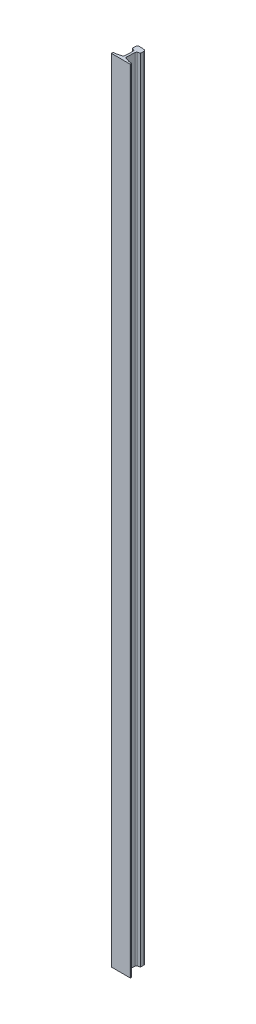
ISO-10303-21;
HEADER;
FILE_DESCRIPTION(('STEP AP214'),'2;1');
FILE_NAME('part.step','',(''),(''),'','','');
FILE_SCHEMA(('AUTOMOTIVE_DESIGN { 1 0 10303 214 1 1 1 1 }'));
ENDSEC;
DATA;
#1=APPLICATION_CONTEXT('core data for automotive mechanical design processes');
#2=APPLICATION_PROTOCOL_DEFINITION('international standard','automotive_design',2000,#1);
#3=PRODUCT_CONTEXT('',#1,'mechanical');
#4=PRODUCT('Part','Part','',(#3));
#5=PRODUCT_RELATED_PRODUCT_CATEGORY('part','',(#4));
#6=PRODUCT_DEFINITION_FORMATION('','',#4);
#7=PRODUCT_DEFINITION_CONTEXT('part definition',#1,'design');
#8=PRODUCT_DEFINITION('design','',#6,#7);
#9=PRODUCT_DEFINITION_SHAPE('','',#8);
#10=(LENGTH_UNIT() NAMED_UNIT(*) SI_UNIT(.MILLI.,.METRE.));
#11=(NAMED_UNIT(*) PLANE_ANGLE_UNIT() SI_UNIT($,.RADIAN.));
#12=(NAMED_UNIT(*) SI_UNIT($,.STERADIAN.) SOLID_ANGLE_UNIT());
#13=UNCERTAINTY_MEASURE_WITH_UNIT(LENGTH_MEASURE(1.E-05),#10,'distance_accuracy_value','');
#14=(GEOMETRIC_REPRESENTATION_CONTEXT(3) GLOBAL_UNCERTAINTY_ASSIGNED_CONTEXT((#13)) GLOBAL_UNIT_ASSIGNED_CONTEXT((#10,
#11,#12)) REPRESENTATION_CONTEXT('',''));
#15=CARTESIAN_POINT('',(0.,0.,0.));
#16=DIRECTION('',(0.,0.,1.));
#17=DIRECTION('',(1.,0.,0.));
#18=AXIS2_PLACEMENT_3D('',#15,#16,#17);
#19=CARTESIAN_POINT('',(40.7594372388262,4620.,-35.0947143526635));
#20=DIRECTION('',(-1.,0.,0.));
#21=DIRECTION('',(0.,0.,1.));
#22=AXIS2_PLACEMENT_3D('',#19,#20,#21);
#23=PLANE('',#22);
#24=DIRECTION('',(0.,0.,-1.));
#25=VECTOR('',#24,1.);
#26=CARTESIAN_POINT('',(40.7594372388262,1540.,-35.0947143526635));
#27=LINE('',#26,#25);
#28=CARTESIAN_POINT('',(40.7594372388262,1540.,-35.5947143526635));
#29=VERTEX_POINT('',#28);
#30=CARTESIAN_POINT('',(40.7594372388262,1540.,-39.1021582767646));
#31=VERTEX_POINT('',#30);
#32=EDGE_CURVE('E275',#29,#31,#27,.T.);
#33=ORIENTED_EDGE('',*,*,#32,.T.);
#34=DIRECTION('',(0.,-1.,0.));
#35=VECTOR('',#34,1.);
#36=CARTESIAN_POINT('',(40.7594372388262,4620.,-39.1021582767646));
#37=LINE('',#36,#35);
#38=CARTESIAN_POINT('',(40.7594372388262,4620.,-39.1021582767646));
#39=VERTEX_POINT('',#38);
#40=EDGE_CURVE('E11',#39,#31,#37,.T.);
#41=ORIENTED_EDGE('',*,*,#40,.F.);
#42=DIRECTION('',(0.,0.,-1.));
#43=VECTOR('',#42,1.);
#44=CARTESIAN_POINT('',(40.7594372388262,4620.,-35.0947143526635));
#45=LINE('',#44,#43);
#46=CARTESIAN_POINT('',(40.7594372388262,4620.,-35.5947143526635));
#47=VERTEX_POINT('',#46);
#48=EDGE_CURVE('E377',#47,#39,#45,.T.);
#49=ORIENTED_EDGE('',*,*,#48,.F.);
#50=DIRECTION('',(0.,-1.,0.));
#51=VECTOR('',#50,1.);
#52=CARTESIAN_POINT('',(40.7594372388262,4620.,-35.5947143526635));
#53=LINE('',#52,#51);
#54=EDGE_CURVE('E70',#47,#29,#53,.T.);
#55=ORIENTED_EDGE('',*,*,#54,.T.);
#56=EDGE_LOOP('',(#33,#41,#49,#55));
#57=FACE_BOUND('',#56,.T.);
#58=ADVANCED_FACE('F53',(#57),#23,.F.);
#59=CARTESIAN_POINT('',(39.2594372388262,4620.,-39.1021582767646));
#60=DIRECTION('',(0.,-1.,0.));
#61=DIRECTION('',(0.,0.,-1.));
#62=AXIS2_PLACEMENT_3D('',#59,#60,#61);
#63=CYLINDRICAL_SURFACE('',#62,1.5);
#64=CARTESIAN_POINT('',(39.2594372388262,1540.,-39.1021582767646));
#65=DIRECTION('',(0.,1.,0.));
#66=DIRECTION('',(0.,0.,1.));
#67=AXIS2_PLACEMENT_3D('',#64,#65,#66);
#68=CIRCLE('',#67,1.5);
#69=CARTESIAN_POINT('',(39.4086899114902,1540.,-40.5947143526635));
#70=VERTEX_POINT('',#69);
#71=EDGE_CURVE('E278',#31,#70,#68,.T.);
#72=ORIENTED_EDGE('',*,*,#71,.T.);
#73=DIRECTION('',(0.,-1.,0.));
#74=VECTOR('',#73,1.);
#75=CARTESIAN_POINT('',(39.4086899114902,4620.,-40.5947143526635));
#76=LINE('',#75,#74);
#77=CARTESIAN_POINT('',(39.4086899114902,4620.,-40.5947143526635));
#78=VERTEX_POINT('',#77);
#79=EDGE_CURVE('E62',#78,#70,#76,.T.);
#80=ORIENTED_EDGE('',*,*,#79,.F.);
#81=CARTESIAN_POINT('',(39.2594372388262,4620.,-39.1021582767646));
#82=DIRECTION('',(0.,1.,0.));
#83=DIRECTION('',(0.,0.,1.));
#84=AXIS2_PLACEMENT_3D('',#81,#82,#83);
#85=CIRCLE('',#84,1.5);
#86=EDGE_CURVE('E168',#39,#78,#85,.T.);
#87=ORIENTED_EDGE('',*,*,#86,.F.);
#88=ORIENTED_EDGE('',*,*,#40,.T.);
#89=EDGE_LOOP('',(#72,#80,#87,#88));
#90=FACE_BOUND('',#89,.T.);
#91=ADVANCED_FACE('F563',(#90),#63,.T.);
#92=CARTESIAN_POINT('',(3.59862844366011,4620.,-44.7599045992653));
#93=DIRECTION('',(-0.115534510185829,0.,0.993303466698934));
#94=DIRECTION('',(0.993303466698934,0.,0.115534510185829));
#95=AXIS2_PLACEMENT_3D('',#92,#93,#94);
#96=PLANE('',#95);
#97=DIRECTION('',(-0.993303466698934,0.,-0.115534510185829));
#98=VECTOR('',#97,1.);
#99=CARTESIAN_POINT('',(3.59862844366011,1540.,-44.7599045992653));
#100=LINE('',#99,#98);
#101=CARTESIAN_POINT('',(28.82415773605,1540.,-41.8258373492434));
#102=VERTEX_POINT('',#101);
#103=EDGE_CURVE('E281',#70,#102,#100,.T.);
#104=ORIENTED_EDGE('',*,*,#103,.T.);
#105=DIRECTION('',(0.,-1.,0.));
#106=VECTOR('',#105,1.);
#107=CARTESIAN_POINT('',(28.82415773605,4620.,-41.8258373492434));
#108=LINE('',#107,#106);
#109=CARTESIAN_POINT('',(28.82415773605,4620.,-41.8258373492434));
#110=VERTEX_POINT('',#109);
#111=EDGE_CURVE('E452',#110,#102,#108,.T.);
#112=ORIENTED_EDGE('',*,*,#111,.F.);
#113=DIRECTION('',(-0.993303466698934,0.,-0.115534510185829));
#114=VECTOR('',#113,1.);
#115=CARTESIAN_POINT('',(3.59862844366011,4620.,-44.7599045992653));
#116=LINE('',#115,#114);
#117=EDGE_CURVE('E461',#78,#110,#116,.T.);
#118=ORIENTED_EDGE('',*,*,#117,.F.);
#119=ORIENTED_EDGE('',*,*,#79,.T.);
#120=EDGE_LOOP('',(#104,#112,#118,#119));
#121=FACE_BOUND('',#120,.T.);
#122=ADVANCED_FACE('F459',(#121),#96,.F.);
#123=CARTESIAN_POINT('',(29.9795028379083,4620.,-51.7588720162328));
#124=DIRECTION('',(0.,-1.,0.));
#125=DIRECTION('',(0.,0.,-1.));
#126=AXIS2_PLACEMENT_3D('',#123,#124,#125);
#127=CYLINDRICAL_SURFACE('',#126,9.99999999999999);
#128=CARTESIAN_POINT('',(29.9795028379083,1540.,-51.7588720162328));
#129=DIRECTION('',(0.,1.,0.));
#130=DIRECTION('',(0.,0.,1.));
#131=AXIS2_PLACEMENT_3D('',#128,#129,#130);
#132=CIRCLE('',#131,9.99999999999999);
#133=CARTESIAN_POINT('',(26.8172251777399,1540.,-42.2720390357276));
#134=VERTEX_POINT('',#133);
#135=EDGE_CURVE('E285',#134,#102,#132,.T.);
#136=ORIENTED_EDGE('',*,*,#135,.F.);
#137=DIRECTION('',(0.,-1.,0.));
#138=VECTOR('',#137,1.);
#139=CARTESIAN_POINT('',(26.8172251777399,4620.,-42.2720390357276));
#140=LINE('',#139,#138);
#141=CARTESIAN_POINT('',(26.8172251777399,4620.,-42.2720390357276));
#142=VERTEX_POINT('',#141);
#143=EDGE_CURVE('E449',#142,#134,#140,.T.);
#144=ORIENTED_EDGE('',*,*,#143,.F.);
#145=CARTESIAN_POINT('',(29.9795028379083,4620.,-51.7588720162328));
#146=DIRECTION('',(0.,1.,0.));
#147=DIRECTION('',(0.,0.,1.));
#148=AXIS2_PLACEMENT_3D('',#145,#146,#147);
#149=CIRCLE('',#148,9.99999999999999);
#150=EDGE_CURVE('E470',#142,#110,#149,.T.);
#151=ORIENTED_EDGE('',*,*,#150,.T.);
#152=ORIENTED_EDGE('',*,*,#111,.T.);
#153=EDGE_LOOP('',(#136,#144,#151,#152));
#154=FACE_BOUND('',#153,.T.);
#155=ADVANCED_FACE('F467',(#154),#127,.F.);
#156=CARTESIAN_POINT('',(7.0619134376368,4620.,-48.8571429490954));
#157=DIRECTION('',(0.316227766016838,0.,-0.948683298050514));
#158=DIRECTION('',(-0.948683298050514,0.,-0.316227766016838));
#159=AXIS2_PLACEMENT_3D('',#156,#157,#158);
#160=PLANE('',#159);
#161=DIRECTION('',(0.948683298050514,0.,0.316227766016838));
#162=VECTOR('',#161,1.);
#163=CARTESIAN_POINT('',(7.0619134376368,1540.,-48.8571429490954));
#164=LINE('',#163,#162);
#165=CARTESIAN_POINT('',(11.8172251777399,1540.,-47.2720390357276));
#166=VERTEX_POINT('',#165);
#167=EDGE_CURVE('E289',#166,#134,#164,.T.);
#168=ORIENTED_EDGE('',*,*,#167,.F.);
#169=DIRECTION('',(0.,-1.,0.));
#170=VECTOR('',#169,1.);
#171=CARTESIAN_POINT('',(11.8172251777399,4620.,-47.2720390357276));
#172=LINE('',#171,#170);
#173=CARTESIAN_POINT('',(11.8172251777399,4620.,-47.2720390357276));
#174=VERTEX_POINT('',#173);
#175=EDGE_CURVE('E446',#174,#166,#172,.T.);
#176=ORIENTED_EDGE('',*,*,#175,.F.);
#177=DIRECTION('',(0.948683298050514,0.,0.316227766016838));
#178=VECTOR('',#177,1.);
#179=CARTESIAN_POINT('',(7.0619134376368,4620.,-48.8571429490954));
#180=LINE('',#179,#178);
#181=EDGE_CURVE('E474',#174,#142,#180,.T.);
#182=ORIENTED_EDGE('',*,*,#181,.T.);
#183=ORIENTED_EDGE('',*,*,#143,.T.);
#184=EDGE_LOOP('',(#168,#176,#182,#183));
#185=FACE_BOUND('',#184,.T.);
#186=ADVANCED_FACE('F578',(#185),#160,.T.);
#187=CARTESIAN_POINT('',(14.6450355001928,4620.,-52.5638713063338));
#188=DIRECTION('',(0.,-1.,0.));
#189=DIRECTION('',(0.,0.,-1.));
#190=AXIS2_PLACEMENT_3D('',#187,#188,#189);
#191=CYLINDRICAL_SURFACE('',#190,6.);
#192=CARTESIAN_POINT('',(14.6450355001928,1540.,-52.5638713063338));
#193=DIRECTION('',(0.,1.,0.));
#194=DIRECTION('',(0.,0.,1.));
#195=AXIS2_PLACEMENT_3D('',#192,#193,#194);
#196=CIRCLE('',#195,6.);
#197=CARTESIAN_POINT('',(8.65544227287482,1540.,-52.9171034838978));
#198=VERTEX_POINT('',#197);
#199=EDGE_CURVE('E293',#198,#166,#196,.T.);
#200=ORIENTED_EDGE('',*,*,#199,.F.);
#201=DIRECTION('',(0.,-1.,0.));
#202=VECTOR('',#201,1.);
#203=CARTESIAN_POINT('',(8.65544227287482,4620.,-52.9171034838978));
#204=LINE('',#203,#202);
#205=CARTESIAN_POINT('',(8.65544227287482,4620.,-52.9171034838978));
#206=VERTEX_POINT('',#205);
#207=EDGE_CURVE('E443',#206,#198,#204,.T.);
#208=ORIENTED_EDGE('',*,*,#207,.F.);
#209=CARTESIAN_POINT('',(14.6450355001928,4620.,-52.5638713063338));
#210=DIRECTION('',(0.,1.,0.));
#211=DIRECTION('',(0.,0.,1.));
#212=AXIS2_PLACEMENT_3D('',#209,#210,#211);
#213=CIRCLE('',#212,6.);
#214=EDGE_CURVE('E478',#206,#174,#213,.T.);
#215=ORIENTED_EDGE('',*,*,#214,.T.);
#216=ORIENTED_EDGE('',*,*,#175,.T.);
#217=EDGE_LOOP('',(#200,#208,#215,#216));
#218=FACE_BOUND('',#217,.T.);
#219=ADVANCED_FACE('F581',(#218),#191,.F.);
#220=CARTESIAN_POINT('',(7.75124412562219,4620.,-34.830906596933));
#221=DIRECTION('',(-0.998752646495627,0.,-0.0499314642082589));
#222=DIRECTION('',(-0.0499314642082589,0.,0.998752646495627));
#223=AXIS2_PLACEMENT_3D('',#220,#221,#222);
#224=PLANE('',#223);
#225=DIRECTION('',(0.0499314642082589,0.,-0.998752646495627));
#226=VECTOR('',#225,1.);
#227=CARTESIAN_POINT('',(7.75124412562219,1540.,-34.830906596933));
#228=LINE('',#227,#226);
#229=CARTESIAN_POINT('',(10.210431510141,1540.,-84.0207300371716));
#230=VERTEX_POINT('',#229);
#231=EDGE_CURVE('E297',#198,#230,#228,.T.);
#232=ORIENTED_EDGE('',*,*,#231,.T.);
#233=DIRECTION('',(0.,-1.,0.));
#234=VECTOR('',#233,1.);
#235=CARTESIAN_POINT('',(10.210431510141,4620.,-84.0207300371716));
#236=LINE('',#235,#234);
#237=CARTESIAN_POINT('',(10.210431510141,4620.,-84.0207300371716));
#238=VERTEX_POINT('',#237);
#239=EDGE_CURVE('E440',#238,#230,#236,.T.);
#240=ORIENTED_EDGE('',*,*,#239,.F.);
#241=DIRECTION('',(0.0499314642082589,0.,-0.998752646495627));
#242=VECTOR('',#241,1.);
#243=CARTESIAN_POINT('',(7.75124412562219,4620.,-34.830906596933));
#244=LINE('',#243,#242);
#245=EDGE_CURVE('E486',#206,#238,#244,.T.);
#246=ORIENTED_EDGE('',*,*,#245,.F.);
#247=ORIENTED_EDGE('',*,*,#207,.T.);
#248=EDGE_LOOP('',(#232,#240,#246,#247));
#249=FACE_BOUND('',#248,.T.);
#250=ADVANCED_FACE('F585',(#249),#224,.F.);
#251=CARTESIAN_POINT('',(16.2043067541645,4620.,-83.7496957974826));
#252=DIRECTION('',(0.,-1.,0.));
#253=DIRECTION('',(0.,0.,-1.));
#254=AXIS2_PLACEMENT_3D('',#251,#252,#253);
#255=CYLINDRICAL_SURFACE('',#254,6.00000000000009);
#256=CARTESIAN_POINT('',(16.2043067541645,1540.,-83.7496957974826));
#257=DIRECTION('',(0.,1.,0.));
#258=DIRECTION('',(0.,0.,1.));
#259=AXIS2_PLACEMENT_3D('',#256,#257,#258);
#260=CIRCLE('',#259,6.00000000000009);
#261=CARTESIAN_POINT('',(14.5927304161733,1540.,-89.5292132260252));
#262=VERTEX_POINT('',#261);
#263=EDGE_CURVE('E301',#262,#230,#260,.T.);
#264=ORIENTED_EDGE('',*,*,#263,.F.);
#265=DIRECTION('',(0.,-1.,0.));
#266=VECTOR('',#265,1.);
#267=CARTESIAN_POINT('',(14.5927304161733,4620.,-89.5292132260252));
#268=LINE('',#267,#266);
#269=CARTESIAN_POINT('',(14.5927304161733,4620.,-89.5292132260252));
#270=VERTEX_POINT('',#269);
#271=EDGE_CURVE('E437',#270,#262,#268,.T.);
#272=ORIENTED_EDGE('',*,*,#271,.F.);
#273=CARTESIAN_POINT('',(16.2043067541645,4620.,-83.7496957974826));
#274=DIRECTION('',(0.,1.,0.));
#275=DIRECTION('',(0.,0.,1.));
#276=AXIS2_PLACEMENT_3D('',#273,#274,#275);
#277=CIRCLE('',#276,6.00000000000009);
#278=EDGE_CURVE('E489',#270,#238,#277,.T.);
#279=ORIENTED_EDGE('',*,*,#278,.T.);
#280=ORIENTED_EDGE('',*,*,#239,.T.);
#281=EDGE_LOOP('',(#264,#272,#279,#280));
#282=FACE_BOUND('',#281,.T.);
#283=ADVANCED_FACE('F589',(#282),#255,.F.);
#284=CARTESIAN_POINT('',(-10.7293993323696,4620.,-82.4720581359521));
#285=DIRECTION('',(-0.268464172063131,0.,-0.963289669994679));
#286=DIRECTION('',(-0.963289669994679,0.,0.268464172063131));
#287=AXIS2_PLACEMENT_3D('',#284,#285,#286);
#288=PLANE('',#287);
#289=DIRECTION('',(0.963289669994679,0.,-0.268464172063131));
#290=VECTOR('',#289,1.);
#291=CARTESIAN_POINT('',(-10.7293993323696,1540.,-82.4720581359521));
#292=LINE('',#291,#290);
#293=CARTESIAN_POINT('',(22.7870136405761,1540.,-91.8129203288972));
#294=VERTEX_POINT('',#293);
#295=EDGE_CURVE('E305',#262,#294,#292,.T.);
#296=ORIENTED_EDGE('',*,*,#295,.T.);
#297=DIRECTION('',(0.,-1.,0.));
#298=VECTOR('',#297,1.);
#299=CARTESIAN_POINT('',(22.7870136405761,4620.,-91.8129203288972));
#300=LINE('',#299,#298);
#301=CARTESIAN_POINT('',(22.7870136405761,4620.,-91.8129203288972));
#302=VERTEX_POINT('',#301);
#303=EDGE_CURVE('E434',#302,#294,#300,.T.);
#304=ORIENTED_EDGE('',*,*,#303,.F.);
#305=DIRECTION('',(0.963289669994679,0.,-0.268464172063131));
#306=VECTOR('',#305,1.);
#307=CARTESIAN_POINT('',(-10.7293993323696,4620.,-82.4720581359521));
#308=LINE('',#307,#306);
#309=EDGE_CURVE('E493',#270,#302,#308,.T.);
#310=ORIENTED_EDGE('',*,*,#309,.F.);
#311=ORIENTED_EDGE('',*,*,#271,.T.);
#312=EDGE_LOOP('',(#296,#304,#310,#311));
#313=FACE_BOUND('',#312,.T.);
#314=ADVANCED_FACE('F593',(#313),#288,.F.);
#315=CARTESIAN_POINT('',(22.518549468513,4620.,-92.7762099988919));
#316=DIRECTION('',(0.,-1.,0.));
#317=DIRECTION('',(0.,0.,-1.));
#318=AXIS2_PLACEMENT_3D('',#315,#316,#317);
#319=CYLINDRICAL_SURFACE('',#318,0.999999999999999);
#320=CARTESIAN_POINT('',(22.518549468513,1540.,-92.7762099988919));
#321=DIRECTION('',(0.,1.,0.));
#322=DIRECTION('',(0.,0.,1.));
#323=AXIS2_PLACEMENT_3D('',#320,#321,#322);
#324=CIRCLE('',#323,0.999999999999999);
#325=CARTESIAN_POINT('',(23.5185494684945,1540.,-92.7762160680998));
#326=VERTEX_POINT('',#325);
#327=EDGE_CURVE('E309',#326,#294,#324,.F.);
#328=ORIENTED_EDGE('',*,*,#327,.F.);
#329=DIRECTION('',(0.,-1.,0.));
#330=VECTOR('',#329,1.);
#331=CARTESIAN_POINT('',(23.5185494684945,4620.,-92.7762160680998));
#332=LINE('',#331,#330);
#333=CARTESIAN_POINT('',(23.5185494684945,4620.,-92.7762160680998));
#334=VERTEX_POINT('',#333);
#335=EDGE_CURVE('E431',#334,#326,#332,.T.);
#336=ORIENTED_EDGE('',*,*,#335,.F.);
#337=CARTESIAN_POINT('',(22.518549468513,4620.,-92.7762099988919));
#338=DIRECTION('',(0.,1.,0.));
#339=DIRECTION('',(0.,0.,1.));
#340=AXIS2_PLACEMENT_3D('',#337,#338,#339);
#341=CIRCLE('',#340,0.999999999999999);
#342=EDGE_CURVE('E496',#334,#302,#341,.F.);
#343=ORIENTED_EDGE('',*,*,#342,.T.);
#344=ORIENTED_EDGE('',*,*,#303,.T.);
#345=EDGE_LOOP('',(#328,#336,#343,#344));
#346=FACE_BOUND('',#345,.T.);
#347=ADVANCED_FACE('F597',(#346),#319,.T.);
#348=CARTESIAN_POINT('',(23.5188995487477,4620.,-35.0948420758813));
#349=DIRECTION('',(0.999999999981582,0.,-6.06920794180174E-06));
#350=DIRECTION('',(-6.06920794180174E-06,0.,-0.999999999981582));
#351=AXIS2_PLACEMENT_3D('',#348,#349,#350);
#352=PLANE('',#351);
#353=DIRECTION('',(6.06920794180174E-06,0.,0.999999999981583));
#354=VECTOR('',#353,1.);
#355=CARTESIAN_POINT('',(23.5188995487477,1540.,-35.0948420758813));
#356=LINE('',#355,#354);
#357=CARTESIAN_POINT('',(23.5184759159674,1540.,-104.89518247869));
#358=VERTEX_POINT('',#357);
#359=EDGE_CURVE('E313',#358,#326,#356,.T.);
#360=ORIENTED_EDGE('',*,*,#359,.F.);
#361=DIRECTION('',(0.,-1.,0.));
#362=VECTOR('',#361,1.);
#363=CARTESIAN_POINT('',(23.5184759159674,4620.,-104.89518247869));
#364=LINE('',#363,#362);
#365=CARTESIAN_POINT('',(23.5184759159674,4620.,-104.89518247869));
#366=VERTEX_POINT('',#365);
#367=EDGE_CURVE('E428',#366,#358,#364,.T.);
#368=ORIENTED_EDGE('',*,*,#367,.F.);
#369=DIRECTION('',(6.06920794180174E-06,0.,0.999999999981583));
#370=VECTOR('',#369,1.);
#371=CARTESIAN_POINT('',(23.5188995487477,4620.,-35.0948420758813));
#372=LINE('',#371,#370);
#373=EDGE_CURVE('E500',#366,#334,#372,.T.);
#374=ORIENTED_EDGE('',*,*,#373,.T.);
#375=ORIENTED_EDGE('',*,*,#335,.T.);
#376=EDGE_LOOP('',(#360,#368,#374,#375));
#377=FACE_BOUND('',#376,.T.);
#378=ADVANCED_FACE('F601',(#377),#352,.T.);
#379=CARTESIAN_POINT('',(17.0195132753637,4620.,-105.011305672061));
#380=DIRECTION('',(0.,-1.,0.));
#381=DIRECTION('',(0.,0.,-1.));
#382=AXIS2_PLACEMENT_3D('',#379,#380,#381);
#383=CYLINDRICAL_SURFACE('',#382,6.50000000000001);
#384=CARTESIAN_POINT('',(17.0195132753637,1540.,-105.011305672061));
#385=DIRECTION('',(0.,1.,0.));
#386=DIRECTION('',(0.,0.,1.));
#387=AXIS2_PLACEMENT_3D('',#384,#385,#386);
#388=CIRCLE('',#387,6.50000000000001);
#389=CARTESIAN_POINT('',(17.8777041256172,1540.,-111.454403410304));
#390=VERTEX_POINT('',#389);
#391=EDGE_CURVE('E317',#390,#358,#388,.F.);
#392=ORIENTED_EDGE('',*,*,#391,.F.);
#393=DIRECTION('',(0.,-1.,0.));
#394=VECTOR('',#393,1.);
#395=CARTESIAN_POINT('',(17.8777041256172,4620.,-111.454403410304));
#396=LINE('',#395,#394);
#397=CARTESIAN_POINT('',(17.8777041256172,4620.,-111.454403410304));
#398=VERTEX_POINT('',#397);
#399=EDGE_CURVE('E425',#398,#390,#396,.T.);
#400=ORIENTED_EDGE('',*,*,#399,.F.);
#401=CARTESIAN_POINT('',(17.0195132753637,4620.,-105.011305672061));
#402=DIRECTION('',(0.,1.,0.));
#403=DIRECTION('',(0.,0.,1.));
#404=AXIS2_PLACEMENT_3D('',#401,#402,#403);
#405=CIRCLE('',#404,6.50000000000001);
#406=EDGE_CURVE('E504',#398,#366,#405,.F.);
#407=ORIENTED_EDGE('',*,*,#406,.T.);
#408=ORIENTED_EDGE('',*,*,#367,.T.);
#409=EDGE_LOOP('',(#392,#400,#407,#408));
#410=FACE_BOUND('',#409,.T.);
#411=ADVANCED_FACE('F605',(#410),#383,.T.);
#412=CARTESIAN_POINT('',(2.63597929414024,4620.,-12.6227798065119));
#413=DIRECTION('',(0.,-1.,0.));
#414=DIRECTION('',(0.,0.,-1.));
#415=AXIS2_PLACEMENT_3D('',#412,#413,#414);
#416=CYLINDRICAL_SURFACE('',#415,100.);
#417=CARTESIAN_POINT('',(2.63597929414024,1540.,-12.6227798065119));
#418=DIRECTION('',(0.,1.,0.));
#419=DIRECTION('',(0.,0.,1.));
#420=AXIS2_PLACEMENT_3D('',#417,#418,#419);
#421=CIRCLE('',#420,100.);
#422=CARTESIAN_POINT('',(-2.67244123679254,1540.,-112.481783764426));
#423=VERTEX_POINT('',#422);
#424=EDGE_CURVE('E321',#390,#423,#421,.T.);
#425=ORIENTED_EDGE('',*,*,#424,.T.);
#426=DIRECTION('',(0.,-1.,0.));
#427=VECTOR('',#426,1.);
#428=CARTESIAN_POINT('',(-2.67244123679254,4620.,-112.481783764426));
#429=LINE('',#428,#427);
#430=CARTESIAN_POINT('',(-2.67244123679254,4620.,-112.481783764426));
#431=VERTEX_POINT('',#430);
#432=EDGE_CURVE('E421',#431,#423,#429,.T.);
#433=ORIENTED_EDGE('',*,*,#432,.F.);
#434=CARTESIAN_POINT('',(2.63597929414024,4620.,-12.6227798065119));
#435=DIRECTION('',(0.,1.,0.));
#436=DIRECTION('',(0.,0.,1.));
#437=AXIS2_PLACEMENT_3D('',#434,#435,#436);
#438=CIRCLE('',#437,100.);
#439=EDGE_CURVE('E508',#398,#431,#438,.T.);
#440=ORIENTED_EDGE('',*,*,#439,.F.);
#441=ORIENTED_EDGE('',*,*,#399,.T.);
#442=EDGE_LOOP('',(#425,#433,#440,#441));
#443=FACE_BOUND('',#442,.T.);
#444=ADVANCED_FACE('F609',(#443),#416,.T.);
#445=CARTESIAN_POINT('',(-2.46285780757964,4620.,-105.985163505692));
#446=DIRECTION('',(0.,-1.,0.));
#447=DIRECTION('',(0.,0.,-1.));
#448=AXIS2_PLACEMENT_3D('',#445,#446,#447);
#449=CYLINDRICAL_SURFACE('',#448,6.49999999999998);
#450=CARTESIAN_POINT('',(-2.46285780757964,1540.,-105.985163505692));
#451=DIRECTION('',(0.,1.,0.));
#452=DIRECTION('',(0.,0.,1.));
#453=AXIS2_PLACEMENT_3D('',#450,#451,#452);
#454=CIRCLE('',#453,6.49999999999998);
#455=CARTESIAN_POINT('',(-8.94098509514056,1540.,-106.517955065459));
#456=VERTEX_POINT('',#455);
#457=EDGE_CURVE('E324',#423,#456,#454,.T.);
#458=ORIENTED_EDGE('',*,*,#457,.T.);
#459=DIRECTION('',(0.,-1.,0.));
#460=VECTOR('',#459,1.);
#461=CARTESIAN_POINT('',(-8.94098509514056,4620.,-106.517955065459));
#462=LINE('',#461,#460);
#463=CARTESIAN_POINT('',(-8.94098509514056,4620.,-106.517955065459));
#464=VERTEX_POINT('',#463);
#465=EDGE_CURVE('E417',#464,#456,#462,.T.);
#466=ORIENTED_EDGE('',*,*,#465,.F.);
#467=CARTESIAN_POINT('',(-2.46285780757964,4620.,-105.985163505692));
#468=DIRECTION('',(0.,1.,0.));
#469=DIRECTION('',(0.,0.,1.));
#470=AXIS2_PLACEMENT_3D('',#467,#468,#469);
#471=CIRCLE('',#470,6.49999999999998);
#472=EDGE_CURVE('E511',#431,#464,#471,.T.);
#473=ORIENTED_EDGE('',*,*,#472,.F.);
#474=ORIENTED_EDGE('',*,*,#432,.T.);
#475=EDGE_LOOP('',(#458,#466,#473,#474));
#476=FACE_BOUND('',#475,.T.);
#477=ADVANCED_FACE('F613',(#476),#449,.T.);
#478=CARTESIAN_POINT('',(-15.9033467847539,4620.,-36.9335277829484));
#479=DIRECTION('',(0.995031640177705,0.,0.0995592037195319));
#480=DIRECTION('',(0.0995592037195319,0.,-0.995031640177705));
#481=AXIS2_PLACEMENT_3D('',#478,#479,#480);
#482=PLANE('',#481);
#483=DIRECTION('',(-0.0995592037195319,0.,0.995031640177705));
#484=VECTOR('',#483,1.);
#485=CARTESIAN_POINT('',(-15.9033467847539,1540.,-36.9335277829484));
#486=LINE('',#485,#484);
#487=CARTESIAN_POINT('',(-10.1503707717966,1540.,-94.4309056667862));
#488=VERTEX_POINT('',#487);
#489=EDGE_CURVE('E327',#456,#488,#486,.T.);
#490=ORIENTED_EDGE('',*,*,#489,.T.);
#491=DIRECTION('',(0.,-1.,0.));
#492=VECTOR('',#491,1.);
#493=CARTESIAN_POINT('',(-10.1503707717966,4620.,-94.4309056667862));
#494=LINE('',#493,#492);
#495=CARTESIAN_POINT('',(-10.1503707717966,4620.,-94.4309056667862));
#496=VERTEX_POINT('',#495);
#497=EDGE_CURVE('E413',#496,#488,#494,.T.);
#498=ORIENTED_EDGE('',*,*,#497,.F.);
#499=DIRECTION('',(-0.0995592037195319,0.,0.995031640177705));
#500=VECTOR('',#499,1.);
#501=CARTESIAN_POINT('',(-15.9033467847539,4620.,-36.9335277829484));
#502=LINE('',#501,#500);
#503=EDGE_CURVE('E514',#464,#496,#502,.T.);
#504=ORIENTED_EDGE('',*,*,#503,.F.);
#505=ORIENTED_EDGE('',*,*,#465,.T.);
#506=EDGE_LOOP('',(#490,#498,#504,#505));
#507=FACE_BOUND('',#506,.T.);
#508=ADVANCED_FACE('F617',(#507),#482,.F.);
#509=CARTESIAN_POINT('',(-9.15533913161888,4620.,-94.3313464630667));
#510=DIRECTION('',(0.,-1.,0.));
#511=DIRECTION('',(0.,0.,-1.));
#512=AXIS2_PLACEMENT_3D('',#509,#510,#511);
#513=CYLINDRICAL_SURFACE('',#512,1.);
#514=CARTESIAN_POINT('',(-9.15533913161888,1540.,-94.3313464630667));
#515=DIRECTION('',(0.,1.,0.));
#516=DIRECTION('',(0.,0.,1.));
#517=AXIS2_PLACEMENT_3D('',#514,#515,#516);
#518=CIRCLE('',#517,1.);
#519=CARTESIAN_POINT('',(-9.51854159596519,1540.,-93.3996362238331));
#520=VERTEX_POINT('',#519);
#521=EDGE_CURVE('E330',#488,#520,#518,.T.);
#522=ORIENTED_EDGE('',*,*,#521,.T.);
#523=DIRECTION('',(0.,-1.,0.));
#524=VECTOR('',#523,1.);
#525=CARTESIAN_POINT('',(-9.51854159596519,4620.,-93.3996362238331));
#526=LINE('',#525,#524);
#527=CARTESIAN_POINT('',(-9.51854159596519,4620.,-93.3996362238331));
#528=VERTEX_POINT('',#527);
#529=EDGE_CURVE('E410',#528,#520,#526,.T.);
#530=ORIENTED_EDGE('',*,*,#529,.F.);
#531=CARTESIAN_POINT('',(-9.15533913161888,4620.,-94.3313464630667));
#532=DIRECTION('',(0.,1.,0.));
#533=DIRECTION('',(0.,0.,1.));
#534=AXIS2_PLACEMENT_3D('',#531,#532,#533);
#535=CIRCLE('',#534,1.);
#536=EDGE_CURVE('E517',#496,#528,#535,.T.);
#537=ORIENTED_EDGE('',*,*,#536,.F.);
#538=ORIENTED_EDGE('',*,*,#497,.T.);
#539=EDGE_LOOP('',(#522,#530,#537,#538));
#540=FACE_BOUND('',#539,.T.);
#541=ADVANCED_FACE('F621',(#540),#513,.T.);
#542=CARTESIAN_POINT('',(20.622724863673,4620.,-81.6498648939999));
#543=DIRECTION('',(-0.363202464346305,0.,0.931710239233621));
#544=DIRECTION('',(0.931710239233621,0.,0.363202464346305));
#545=AXIS2_PLACEMENT_3D('',#542,#543,#544);
#546=PLANE('',#545);
#547=DIRECTION('',(-0.931710239233621,0.,-0.363202464346305));
#548=VECTOR('',#547,1.);
#549=CARTESIAN_POINT('',(20.622724863673,1540.,-81.6498648939999));
#550=LINE('',#549,#548);
#551=CARTESIAN_POINT('',(-1.59289075471972,1540.,-90.310031971489));
#552=VERTEX_POINT('',#551);
#553=EDGE_CURVE('E334',#552,#520,#550,.T.);
#554=ORIENTED_EDGE('',*,*,#553,.F.);
#555=DIRECTION('',(0.,-1.,0.));
#556=VECTOR('',#555,1.);
#557=CARTESIAN_POINT('',(-1.59289075471972,4620.,-90.310031971489));
#558=LINE('',#557,#556);
#559=CARTESIAN_POINT('',(-1.59289075471972,4620.,-90.310031971489));
#560=VERTEX_POINT('',#559);
#561=EDGE_CURVE('E407',#560,#552,#558,.T.);
#562=ORIENTED_EDGE('',*,*,#561,.F.);
#563=DIRECTION('',(-0.931710239233621,0.,-0.363202464346305));
#564=VECTOR('',#563,1.);
#565=CARTESIAN_POINT('',(20.622724863673,4620.,-81.6498648939999));
#566=LINE('',#565,#564);
#567=EDGE_CURVE('E520',#560,#528,#566,.T.);
#568=ORIENTED_EDGE('',*,*,#567,.T.);
#569=ORIENTED_EDGE('',*,*,#529,.T.);
#570=EDGE_LOOP('',(#554,#562,#568,#569));
#571=FACE_BOUND('',#570,.T.);
#572=ADVANCED_FACE('F625',(#571),#546,.T.);
#573=CARTESIAN_POINT('',(-3.77210554079757,4620.,-84.7197705360873));
#574=DIRECTION('',(0.,-1.,0.));
#575=DIRECTION('',(0.,0.,-1.));
#576=AXIS2_PLACEMENT_3D('',#573,#574,#575);
#577=CYLINDRICAL_SURFACE('',#576,6.00000000000001);
#578=CARTESIAN_POINT('',(-3.77210554079757,1540.,-84.7197705360873));
#579=DIRECTION('',(0.,1.,0.));
#580=DIRECTION('',(0.,0.,1.));
#581=AXIS2_PLACEMENT_3D('',#578,#579,#580);
#582=CIRCLE('',#581,6.00000000000001);
#583=CARTESIAN_POINT('',(2.22041033817622,1540.,-84.4201817508377));
#584=VERTEX_POINT('',#583);
#585=EDGE_CURVE('E338',#552,#584,#582,.F.);
#586=ORIENTED_EDGE('',*,*,#585,.T.);
#587=DIRECTION('',(0.,-1.,0.));
#588=VECTOR('',#587,1.);
#589=CARTESIAN_POINT('',(2.22041033817622,4620.,-84.4201817508377));
#590=LINE('',#589,#588);
#591=CARTESIAN_POINT('',(2.22041033817622,4620.,-84.4201817508377));
#592=VERTEX_POINT('',#591);
#593=EDGE_CURVE('E404',#592,#584,#590,.T.);
#594=ORIENTED_EDGE('',*,*,#593,.F.);
#595=CARTESIAN_POINT('',(-3.77210554079757,4620.,-84.7197705360873));
#596=DIRECTION('',(0.,1.,0.));
#597=DIRECTION('',(0.,0.,1.));
#598=AXIS2_PLACEMENT_3D('',#595,#596,#597);
#599=CIRCLE('',#598,6.00000000000001);
#600=EDGE_CURVE('E524',#560,#592,#599,.F.);
#601=ORIENTED_EDGE('',*,*,#600,.F.);
#602=ORIENTED_EDGE('',*,*,#561,.T.);
#603=EDGE_LOOP('',(#586,#594,#601,#602));
#604=FACE_BOUND('',#603,.T.);
#605=ADVANCED_FACE('F629',(#604),#577,.F.);
#606=CARTESIAN_POINT('',(-0.22806660380207,4620.,-35.229231337774));
#607=DIRECTION('',(-0.998763524427815,0.,-0.0497134013373531));
#608=DIRECTION('',(-0.0497134013373531,0.,0.998763524427815));
#609=AXIS2_PLACEMENT_3D('',#606,#607,#608);
#610=PLANE('',#609);
#611=DIRECTION('',(0.0497134013373531,0.,-0.998763524427815));
#612=VECTOR('',#611,1.);
#613=CARTESIAN_POINT('',(-0.22806660380207,1540.,-35.229231337774));
#614=LINE('',#613,#612);
#615=CARTESIAN_POINT('',(0.684732849310307,1540.,-53.5677632901491));
#616=VERTEX_POINT('',#615);
#617=EDGE_CURVE('E342',#616,#584,#614,.T.);
#618=ORIENTED_EDGE('',*,*,#617,.F.);
#619=DIRECTION('',(0.,-1.,0.));
#620=VECTOR('',#619,1.);
#621=CARTESIAN_POINT('',(0.684732849310307,4620.,-53.5677632901491));
#622=LINE('',#621,#620);
#623=CARTESIAN_POINT('',(0.684732849310307,4620.,-53.5677632901491));
#624=VERTEX_POINT('',#623);
#625=EDGE_CURVE('E401',#624,#616,#622,.T.);
#626=ORIENTED_EDGE('',*,*,#625,.F.);
#627=DIRECTION('',(0.0497134013373531,0.,-0.998763524427815));
#628=VECTOR('',#627,1.);
#629=CARTESIAN_POINT('',(-0.22806660380207,4620.,-35.229231337774));
#630=LINE('',#629,#628);
#631=EDGE_CURVE('E527',#624,#592,#630,.T.);
#632=ORIENTED_EDGE('',*,*,#631,.T.);
#633=ORIENTED_EDGE('',*,*,#593,.T.);
#634=EDGE_LOOP('',(#618,#626,#632,#633));
#635=FACE_BOUND('',#634,.T.);
#636=ADVANCED_FACE('F633',(#635),#610,.T.);
#637=CARTESIAN_POINT('',(-5.30778302966346,4620.,-53.8673520753987));
#638=DIRECTION('',(0.,-1.,0.));
#639=DIRECTION('',(0.,0.,-1.));
#640=AXIS2_PLACEMENT_3D('',#637,#638,#639);
#641=CYLINDRICAL_SURFACE('',#640,6.);
#642=CARTESIAN_POINT('',(-5.30778302966346,1540.,-53.8673520753987));
#643=DIRECTION('',(0.,1.,0.));
#644=DIRECTION('',(0.,0.,1.));
#645=AXIS2_PLACEMENT_3D('',#642,#643,#644);
#646=CIRCLE('',#645,6.);
#647=CARTESIAN_POINT('',(-3.53928627099803,1540.,-48.1339046644085));
#648=VERTEX_POINT('',#647);
#649=EDGE_CURVE('E346',#616,#648,#646,.F.);
#650=ORIENTED_EDGE('',*,*,#649,.T.);
#651=DIRECTION('',(0.,-1.,0.));
#652=VECTOR('',#651,1.);
#653=CARTESIAN_POINT('',(-3.53928627099803,4620.,-48.1339046644085));
#654=LINE('',#653,#652);
#655=CARTESIAN_POINT('',(-3.53928627099803,4620.,-48.1339046644085));
#656=VERTEX_POINT('',#655);
#657=EDGE_CURVE('E397',#656,#648,#654,.T.);
#658=ORIENTED_EDGE('',*,*,#657,.F.);
#659=CARTESIAN_POINT('',(-5.30778302966346,4620.,-53.8673520753987));
#660=DIRECTION('',(0.,1.,0.));
#661=DIRECTION('',(0.,0.,1.));
#662=AXIS2_PLACEMENT_3D('',#659,#660,#661);
#663=CIRCLE('',#662,6.);
#664=EDGE_CURVE('E531',#624,#656,#663,.F.);
#665=ORIENTED_EDGE('',*,*,#664,.F.);
#666=ORIENTED_EDGE('',*,*,#625,.T.);
#667=EDGE_LOOP('',(#650,#658,#665,#666));
#668=FACE_BOUND('',#667,.T.);
#669=ADVANCED_FACE('F637',(#668),#641,.F.);
#670=CARTESIAN_POINT('',(-1.72057277876501,4620.,-48.6948915690394));
#671=DIRECTION('',(0.294749459777571,0.,0.955574568498362));
#672=DIRECTION('',(0.955574568498362,0.,-0.294749459777571));
#673=AXIS2_PLACEMENT_3D('',#670,#671,#672);
#674=PLANE('',#673);
#675=DIRECTION('',(-0.955574568498362,0.,0.294749459777571));
#676=VECTOR('',#675,1.);
#677=CARTESIAN_POINT('',(-1.72057277876501,1540.,-48.6948915690394));
#678=LINE('',#677,#676);
#679=CARTESIAN_POINT('',(-17.9538590158701,1540.,-43.6876922289393));
#680=VERTEX_POINT('',#679);
#681=EDGE_CURVE('E349',#648,#680,#678,.T.);
#682=ORIENTED_EDGE('',*,*,#681,.T.);
#683=DIRECTION('',(0.,-1.,0.));
#684=VECTOR('',#683,1.);
#685=CARTESIAN_POINT('',(-17.9538590158701,4620.,-43.6876922289393));
#686=LINE('',#685,#684);
#687=CARTESIAN_POINT('',(-17.9538590158701,4620.,-43.6876922289393));
#688=VERTEX_POINT('',#687);
#689=EDGE_CURVE('E393',#688,#680,#686,.T.);
#690=ORIENTED_EDGE('',*,*,#689,.F.);
#691=DIRECTION('',(-0.955574568498362,0.,0.294749459777571));
#692=VECTOR('',#691,1.);
#693=CARTESIAN_POINT('',(-1.72057277876501,4620.,-48.6948915690394));
#694=LINE('',#693,#692);
#695=EDGE_CURVE('E534',#656,#688,#694,.T.);
#696=ORIENTED_EDGE('',*,*,#695,.F.);
#697=ORIENTED_EDGE('',*,*,#657,.T.);
#698=EDGE_LOOP('',(#682,#690,#696,#697));
#699=FACE_BOUND('',#698,.T.);
#700=ADVANCED_FACE('F641',(#699),#674,.F.);
#701=CARTESIAN_POINT('',(-20.9013536136458,4620.,-53.2434379139229));
#702=DIRECTION('',(0.,-1.,0.));
#703=DIRECTION('',(0.,0.,-1.));
#704=AXIS2_PLACEMENT_3D('',#701,#702,#703);
#705=CYLINDRICAL_SURFACE('',#704,10.);
#706=CARTESIAN_POINT('',(-20.9013536136458,1540.,-53.2434379139229));
#707=DIRECTION('',(0.,1.,0.));
#708=DIRECTION('',(0.,0.,1.));
#709=AXIS2_PLACEMENT_3D('',#706,#707,#708);
#710=CIRCLE('',#709,10.);
#711=CARTESIAN_POINT('',(-19.9063152316477,1540.,-43.2930661310019));
#712=VERTEX_POINT('',#711);
#713=EDGE_CURVE('E352',#680,#712,#710,.F.);
#714=ORIENTED_EDGE('',*,*,#713,.T.);
#715=DIRECTION('',(0.,-1.,0.));
#716=VECTOR('',#715,1.);
#717=CARTESIAN_POINT('',(-19.9063152316477,4620.,-43.2930661310019));
#718=LINE('',#717,#716);
#719=CARTESIAN_POINT('',(-19.9063152316477,4620.,-43.2930661310019));
#720=VERTEX_POINT('',#719);
#721=EDGE_CURVE('E390',#720,#712,#718,.T.);
#722=ORIENTED_EDGE('',*,*,#721,.F.);
#723=CARTESIAN_POINT('',(-20.9013536136458,4620.,-53.2434379139229));
#724=DIRECTION('',(0.,1.,0.));
#725=DIRECTION('',(0.,0.,1.));
#726=AXIS2_PLACEMENT_3D('',#723,#724,#725);
#727=CIRCLE('',#726,10.);
#728=EDGE_CURVE('E537',#688,#720,#727,.F.);
#729=ORIENTED_EDGE('',*,*,#728,.F.);
#730=ORIENTED_EDGE('',*,*,#689,.T.);
#731=EDGE_LOOP('',(#714,#722,#729,#730));
#732=FACE_BOUND('',#731,.T.);
#733=ADVANCED_FACE('F645',(#732),#705,.F.);
#734=CARTESIAN_POINT('',(1.44112613903866,4620.,-45.4278128504909));
#735=DIRECTION('',(-0.0995038381998069,0.,-0.995037178292101));
#736=DIRECTION('',(-0.995037178292101,0.,0.099503838199807));
#737=AXIS2_PLACEMENT_3D('',#734,#735,#736);
#738=PLANE('',#737);
#739=DIRECTION('',(0.995037178292101,0.,-0.099503838199807));
#740=VECTOR('',#739,1.);
#741=CARTESIAN_POINT('',(1.44112613903866,1540.,-45.4278128504909));
#742=LINE('',#741,#740);
#743=CARTESIAN_POINT('',(-31.8898185184735,1540.,-42.0947143526635));
#744=VERTEX_POINT('',#743);
#745=EDGE_CURVE('E356',#744,#712,#742,.T.);
#746=ORIENTED_EDGE('',*,*,#745,.F.);
#747=DIRECTION('',(0.,-1.,0.));
#748=VECTOR('',#747,1.);
#749=CARTESIAN_POINT('',(-31.8898185184735,4620.,-42.0947143526635));
#750=LINE('',#749,#748);
#751=CARTESIAN_POINT('',(-31.8898185184735,4620.,-42.0947143526635));
#752=VERTEX_POINT('',#751);
#753=EDGE_CURVE('E387',#752,#744,#750,.T.);
#754=ORIENTED_EDGE('',*,*,#753,.F.);
#755=DIRECTION('',(0.995037178292101,0.,-0.099503838199807));
#756=VECTOR('',#755,1.);
#757=CARTESIAN_POINT('',(1.44112613903866,4620.,-45.4278128504909));
#758=LINE('',#757,#756);
#759=EDGE_CURVE('E540',#752,#720,#758,.T.);
#760=ORIENTED_EDGE('',*,*,#759,.T.);
#761=ORIENTED_EDGE('',*,*,#721,.T.);
#762=EDGE_LOOP('',(#746,#754,#760,#761));
#763=FACE_BOUND('',#762,.T.);
#764=ADVANCED_FACE('F649',(#763),#738,.T.);
#765=CARTESIAN_POINT('',(-31.7405627611738,4620.,-40.6021585852254));
#766=DIRECTION('',(0.,-1.,0.));
#767=DIRECTION('',(0.,0.,-1.));
#768=AXIS2_PLACEMENT_3D('',#765,#766,#767);
#769=CYLINDRICAL_SURFACE('',#768,1.5);
#770=CARTESIAN_POINT('',(-31.7405627611738,1540.,-40.6021585852254));
#771=DIRECTION('',(0.,1.,0.));
#772=DIRECTION('',(0.,0.,1.));
#773=AXIS2_PLACEMENT_3D('',#770,#771,#772);
#774=CIRCLE('',#773,1.5);
#775=CARTESIAN_POINT('',(-33.2405627611738,1540.,-40.6021585852254));
#776=VERTEX_POINT('',#775);
#777=EDGE_CURVE('E360',#776,#744,#774,.F.);
#778=ORIENTED_EDGE('',*,*,#777,.F.);
#779=DIRECTION('',(0.,-1.,0.));
#780=VECTOR('',#779,1.);
#781=CARTESIAN_POINT('',(-33.2405627611738,4620.,-40.6021585852254));
#782=LINE('',#781,#780);
#783=CARTESIAN_POINT('',(-33.2405627611738,4620.,-40.6021585852254));
#784=VERTEX_POINT('',#783);
#785=EDGE_CURVE('E384',#784,#776,#782,.T.);
#786=ORIENTED_EDGE('',*,*,#785,.F.);
#787=CARTESIAN_POINT('',(-31.7405627611738,4620.,-40.6021585852254));
#788=DIRECTION('',(0.,1.,0.));
#789=DIRECTION('',(0.,0.,1.));
#790=AXIS2_PLACEMENT_3D('',#787,#788,#789);
#791=CIRCLE('',#790,1.5);
#792=EDGE_CURVE('E544',#784,#752,#791,.F.);
#793=ORIENTED_EDGE('',*,*,#792,.T.);
#794=ORIENTED_EDGE('',*,*,#753,.T.);
#795=EDGE_LOOP('',(#778,#786,#793,#794));
#796=FACE_BOUND('',#795,.T.);
#797=ADVANCED_FACE('F653',(#796),#769,.T.);
#798=CARTESIAN_POINT('',(-33.2405627611738,4620.,-35.0947143526636));
#799=DIRECTION('',(-1.,0.,0.));
#800=DIRECTION('',(0.,0.,1.));
#801=AXIS2_PLACEMENT_3D('',#798,#799,#800);
#802=PLANE('',#801);
#803=DIRECTION('',(0.,0.,-1.));
#804=VECTOR('',#803,1.);
#805=CARTESIAN_POINT('',(-33.2405627611738,1540.,-35.0947143526636));
#806=LINE('',#805,#804);
#807=CARTESIAN_POINT('',(-33.2405627611738,1540.,-35.5947143526635));
#808=VERTEX_POINT('',#807);
#809=EDGE_CURVE('E364',#808,#776,#806,.T.);
#810=ORIENTED_EDGE('',*,*,#809,.F.);
#811=DIRECTION('',(0.,-1.,0.));
#812=VECTOR('',#811,1.);
#813=CARTESIAN_POINT('',(-33.2405627611738,4620.,-35.5947143526635));
#814=LINE('',#813,#812);
#815=CARTESIAN_POINT('',(-33.2405627611738,4620.,-35.5947143526635));
#816=VERTEX_POINT('',#815);
#817=EDGE_CURVE('E265',#816,#808,#814,.T.);
#818=ORIENTED_EDGE('',*,*,#817,.F.);
#819=DIRECTION('',(0.,0.,-1.));
#820=VECTOR('',#819,1.);
#821=CARTESIAN_POINT('',(-33.2405627611738,4620.,-35.0947143526636));
#822=LINE('',#821,#820);
#823=EDGE_CURVE('E253',#816,#784,#822,.T.);
#824=ORIENTED_EDGE('',*,*,#823,.T.);
#825=ORIENTED_EDGE('',*,*,#785,.T.);
#826=EDGE_LOOP('',(#810,#818,#824,#825));
#827=FACE_BOUND('',#826,.T.);
#828=ADVANCED_FACE('F550',(#827),#802,.T.);
#829=CARTESIAN_POINT('',(-32.7405627611738,4620.,-35.5947143526635));
#830=DIRECTION('',(0.,-1.,0.));
#831=DIRECTION('',(0.,0.,-1.));
#832=AXIS2_PLACEMENT_3D('',#829,#830,#831);
#833=CYLINDRICAL_SURFACE('',#832,0.5);
#834=CARTESIAN_POINT('',(-32.7405627611738,1540.,-35.5947143526635));
#835=DIRECTION('',(0.,1.,0.));
#836=DIRECTION('',(0.,0.,1.));
#837=AXIS2_PLACEMENT_3D('',#834,#835,#836);
#838=CIRCLE('',#837,0.5);
#839=CARTESIAN_POINT('',(-32.7405627611738,1540.,-35.0947143526635));
#840=VERTEX_POINT('',#839);
#841=EDGE_CURVE('E261',#808,#840,#838,.T.);
#842=ORIENTED_EDGE('',*,*,#841,.T.);
#843=DIRECTION('',(0.,-1.,0.));
#844=VECTOR('',#843,1.);
#845=CARTESIAN_POINT('',(-32.7405627611738,4620.,-35.0947143526635));
#846=LINE('',#845,#844);
#847=CARTESIAN_POINT('',(-32.7405627611738,4620.,-35.0947143526635));
#848=VERTEX_POINT('',#847);
#849=EDGE_CURVE('E258',#848,#840,#846,.T.);
#850=ORIENTED_EDGE('',*,*,#849,.F.);
#851=CARTESIAN_POINT('',(-32.7405627611738,4620.,-35.5947143526635));
#852=DIRECTION('',(0.,1.,0.));
#853=DIRECTION('',(0.,0.,1.));
#854=AXIS2_PLACEMENT_3D('',#851,#852,#853);
#855=CIRCLE('',#854,0.5);
#856=EDGE_CURVE('E245',#816,#848,#855,.T.);
#857=ORIENTED_EDGE('',*,*,#856,.F.);
#858=ORIENTED_EDGE('',*,*,#817,.T.);
#859=EDGE_LOOP('',(#842,#850,#857,#858));
#860=FACE_BOUND('',#859,.T.);
#861=ADVANCED_FACE('F259',(#860),#833,.T.);
#862=CARTESIAN_POINT('',(2.47443723882619,4620.,-35.0947143526635));
#863=DIRECTION('',(0.,0.,1.));
#864=DIRECTION('',(1.,0.,0.));
#865=AXIS2_PLACEMENT_3D('',#862,#863,#864);
#866=PLANE('',#865);
#867=DIRECTION('',(-1.,0.,0.));
#868=VECTOR('',#867,1.);
#869=CARTESIAN_POINT('',(2.47443723882619,1540.,-35.0947143526635));
#870=LINE('',#869,#868);
#871=CARTESIAN_POINT('',(40.2594372388262,1540.,-35.0947143526635));
#872=VERTEX_POINT('',#871);
#873=EDGE_CURVE('E370',#872,#840,#870,.T.);
#874=ORIENTED_EDGE('',*,*,#873,.F.);
#875=DIRECTION('',(0.,-1.,0.));
#876=VECTOR('',#875,1.);
#877=CARTESIAN_POINT('',(40.2594372388262,4620.,-35.0947143526635));
#878=LINE('',#877,#876);
#879=CARTESIAN_POINT('',(40.2594372388262,4620.,-35.0947143526635));
#880=VERTEX_POINT('',#879);
#881=EDGE_CURVE('E156',#880,#872,#878,.T.);
#882=ORIENTED_EDGE('',*,*,#881,.F.);
#883=DIRECTION('',(-1.,0.,0.));
#884=VECTOR('',#883,1.);
#885=CARTESIAN_POINT('',(2.47443723882619,4620.,-35.0947143526635));
#886=LINE('',#885,#884);
#887=EDGE_CURVE('E250',#880,#848,#886,.T.);
#888=ORIENTED_EDGE('',*,*,#887,.T.);
#889=ORIENTED_EDGE('',*,*,#849,.T.);
#890=EDGE_LOOP('',(#874,#882,#888,#889));
#891=FACE_BOUND('',#890,.T.);
#892=ADVANCED_FACE('F267',(#891),#866,.T.);
#893=CARTESIAN_POINT('',(40.2594372388262,4620.,-35.5947143526635));
#894=DIRECTION('',(0.,-1.,0.));
#895=DIRECTION('',(0.,0.,-1.));
#896=AXIS2_PLACEMENT_3D('',#893,#894,#895);
#897=CYLINDRICAL_SURFACE('',#896,0.5);
#898=CARTESIAN_POINT('',(40.2594372388262,1540.,-35.5947143526635));
#899=DIRECTION('',(0.,1.,0.));
#900=DIRECTION('',(0.,0.,1.));
#901=AXIS2_PLACEMENT_3D('',#898,#899,#900);
#902=CIRCLE('',#901,0.5);
#903=EDGE_CURVE('E373',#29,#872,#902,.F.);
#904=ORIENTED_EDGE('',*,*,#903,.F.);
#905=ORIENTED_EDGE('',*,*,#54,.F.);
#906=CARTESIAN_POINT('',(40.2594372388262,4620.,-35.5947143526635));
#907=DIRECTION('',(0.,1.,0.));
#908=DIRECTION('',(0.,0.,1.));
#909=AXIS2_PLACEMENT_3D('',#906,#907,#908);
#910=CIRCLE('',#909,0.5);
#911=EDGE_CURVE('E269',#47,#880,#910,.F.);
#912=ORIENTED_EDGE('',*,*,#911,.T.);
#913=ORIENTED_EDGE('',*,*,#881,.T.);
#914=EDGE_LOOP('',(#904,#905,#912,#913));
#915=FACE_BOUND('',#914,.T.);
#916=ADVANCED_FACE('F552',(#915),#897,.T.);
#917=CARTESIAN_POINT('',(2.47443723882619,4620.,-35.0947143526635));
#918=DIRECTION('',(0.,1.,0.));
#919=DIRECTION('',(0.,0.,1.));
#920=AXIS2_PLACEMENT_3D('',#917,#918,#919);
#921=PLANE('',#920);
#922=ORIENTED_EDGE('',*,*,#48,.T.);
#923=ORIENTED_EDGE('',*,*,#86,.T.);
#924=ORIENTED_EDGE('',*,*,#117,.T.);
#925=ORIENTED_EDGE('',*,*,#150,.F.);
#926=ORIENTED_EDGE('',*,*,#181,.F.);
#927=ORIENTED_EDGE('',*,*,#214,.F.);
#928=ORIENTED_EDGE('',*,*,#245,.T.);
#929=ORIENTED_EDGE('',*,*,#278,.F.);
#930=ORIENTED_EDGE('',*,*,#309,.T.);
#931=ORIENTED_EDGE('',*,*,#342,.F.);
#932=ORIENTED_EDGE('',*,*,#373,.F.);
#933=ORIENTED_EDGE('',*,*,#406,.F.);
#934=ORIENTED_EDGE('',*,*,#439,.T.);
#935=ORIENTED_EDGE('',*,*,#472,.T.);
#936=ORIENTED_EDGE('',*,*,#503,.T.);
#937=ORIENTED_EDGE('',*,*,#536,.T.);
#938=ORIENTED_EDGE('',*,*,#567,.F.);
#939=ORIENTED_EDGE('',*,*,#600,.T.);
#940=ORIENTED_EDGE('',*,*,#631,.F.);
#941=ORIENTED_EDGE('',*,*,#664,.T.);
#942=ORIENTED_EDGE('',*,*,#695,.T.);
#943=ORIENTED_EDGE('',*,*,#728,.T.);
#944=ORIENTED_EDGE('',*,*,#759,.F.);
#945=ORIENTED_EDGE('',*,*,#792,.F.);
#946=ORIENTED_EDGE('',*,*,#823,.F.);
#947=ORIENTED_EDGE('',*,*,#856,.T.);
#948=ORIENTED_EDGE('',*,*,#887,.F.);
#949=ORIENTED_EDGE('',*,*,#911,.F.);
#950=EDGE_LOOP('',(#922,#923,#924,#925,#926,#927,#928,#929,#930,#931,#932,#933,#934,#935,#936,
#937,#938,#939,#940,#941,#942,#943,#944,#945,#946,#947,#948,#949));
#951=FACE_BOUND('',#950,.T.);
#952=ADVANCED_FACE('F247',(#951),#921,.T.);
#953=CARTESIAN_POINT('',(2.47443723882619,1540.,-35.0947143526635));
#954=DIRECTION('',(0.,1.,0.));
#955=DIRECTION('',(0.,0.,1.));
#956=AXIS2_PLACEMENT_3D('',#953,#954,#955);
#957=PLANE('',#956);
#958=ORIENTED_EDGE('',*,*,#32,.F.);
#959=ORIENTED_EDGE('',*,*,#903,.T.);
#960=ORIENTED_EDGE('',*,*,#873,.T.);
#961=ORIENTED_EDGE('',*,*,#841,.F.);
#962=ORIENTED_EDGE('',*,*,#809,.T.);
#963=ORIENTED_EDGE('',*,*,#777,.T.);
#964=ORIENTED_EDGE('',*,*,#745,.T.);
#965=ORIENTED_EDGE('',*,*,#713,.F.);
#966=ORIENTED_EDGE('',*,*,#681,.F.);
#967=ORIENTED_EDGE('',*,*,#649,.F.);
#968=ORIENTED_EDGE('',*,*,#617,.T.);
#969=ORIENTED_EDGE('',*,*,#585,.F.);
#970=ORIENTED_EDGE('',*,*,#553,.T.);
#971=ORIENTED_EDGE('',*,*,#521,.F.);
#972=ORIENTED_EDGE('',*,*,#489,.F.);
#973=ORIENTED_EDGE('',*,*,#457,.F.);
#974=ORIENTED_EDGE('',*,*,#424,.F.);
#975=ORIENTED_EDGE('',*,*,#391,.T.);
#976=ORIENTED_EDGE('',*,*,#359,.T.);
#977=ORIENTED_EDGE('',*,*,#327,.T.);
#978=ORIENTED_EDGE('',*,*,#295,.F.);
#979=ORIENTED_EDGE('',*,*,#263,.T.);
#980=ORIENTED_EDGE('',*,*,#231,.F.);
#981=ORIENTED_EDGE('',*,*,#199,.T.);
#982=ORIENTED_EDGE('',*,*,#167,.T.);
#983=ORIENTED_EDGE('',*,*,#135,.T.);
#984=ORIENTED_EDGE('',*,*,#103,.F.);
#985=ORIENTED_EDGE('',*,*,#71,.F.);
#986=EDGE_LOOP('',(#958,#959,#960,#961,#962,#963,#964,#965,#966,#967,#968,#969,#970,#971,#972,
#973,#974,#975,#976,#977,#978,#979,#980,#981,#982,#983,#984,#985));
#987=FACE_BOUND('',#986,.T.);
#988=ADVANCED_FACE('F463',(#987),#957,.F.);
#989=CLOSED_SHELL('',(#58,#91,#122,#155,#186,#219,#250,#283,#314,#347,#378,#411,#444,#477,#508,
#541,#572,#605,#636,#669,#700,#733,#764,#797,#828,#861,#892,#916,#952,#988));
#990=MANIFOLD_SOLID_BREP('B2',#989);
#991=ADVANCED_BREP_SHAPE_REPRESENTATION('',(#18,#990),#14);
#992=SHAPE_DEFINITION_REPRESENTATION(#9,#991);
ENDSEC;
END-ISO-10303-21;
